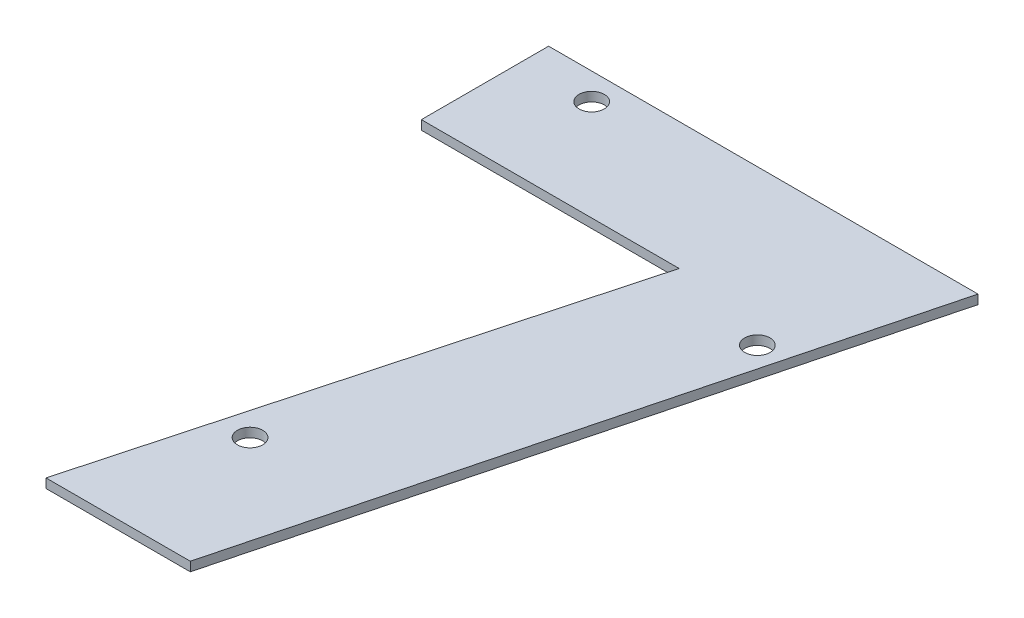
ISO-10303-21;
HEADER;
FILE_DESCRIPTION(('STEP AP214'),'2;1');
FILE_NAME('part.step','',(''),(''),'','','');
FILE_SCHEMA(('AUTOMOTIVE_DESIGN { 1 0 10303 214 1 1 1 1 }'));
ENDSEC;
DATA;
#1=APPLICATION_CONTEXT('core data for automotive mechanical design processes');
#2=APPLICATION_PROTOCOL_DEFINITION('international standard','automotive_design',2000,#1);
#3=PRODUCT_CONTEXT('',#1,'mechanical');
#4=PRODUCT('Part','Part','',(#3));
#5=PRODUCT_RELATED_PRODUCT_CATEGORY('part','',(#4));
#6=PRODUCT_DEFINITION_FORMATION('','',#4);
#7=PRODUCT_DEFINITION_CONTEXT('part definition',#1,'design');
#8=PRODUCT_DEFINITION('design','',#6,#7);
#9=PRODUCT_DEFINITION_SHAPE('','',#8);
#10=(LENGTH_UNIT() NAMED_UNIT(*) SI_UNIT(.MILLI.,.METRE.));
#11=(NAMED_UNIT(*) PLANE_ANGLE_UNIT() SI_UNIT($,.RADIAN.));
#12=(NAMED_UNIT(*) SI_UNIT($,.STERADIAN.) SOLID_ANGLE_UNIT());
#13=UNCERTAINTY_MEASURE_WITH_UNIT(LENGTH_MEASURE(1.E-05),#10,'distance_accuracy_value','');
#14=(GEOMETRIC_REPRESENTATION_CONTEXT(3) GLOBAL_UNCERTAINTY_ASSIGNED_CONTEXT((#13)) GLOBAL_UNIT_ASSIGNED_CONTEXT((#10,
#11,#12)) REPRESENTATION_CONTEXT('',''));
#15=CARTESIAN_POINT('',(0.,0.,0.));
#16=DIRECTION('',(0.,0.,1.));
#17=DIRECTION('',(1.,0.,0.));
#18=AXIS2_PLACEMENT_3D('',#15,#16,#17);
#19=CARTESIAN_POINT('',(-32.8064300635889,2.,-24.3237173628121));
#20=DIRECTION('',(1.,0.,0.));
#21=DIRECTION('',(0.,0.,-1.));
#22=AXIS2_PLACEMENT_3D('',#19,#20,#21);
#23=PLANE('',#22);
#24=DIRECTION('',(0.,0.,1.));
#25=VECTOR('',#24,1.);
#26=CARTESIAN_POINT('',(-32.8064300635889,0.,-24.3237173628121));
#27=LINE('',#26,#25);
#28=CARTESIAN_POINT('',(-32.8064300635889,0.,-51.9945518958334));
#29=VERTEX_POINT('',#28);
#30=CARTESIAN_POINT('',(-32.8064300635889,0.,-24.3237173628121));
#31=VERTEX_POINT('',#30);
#32=EDGE_CURVE('E124',#29,#31,#27,.T.);
#33=ORIENTED_EDGE('',*,*,#32,.T.);
#34=DIRECTION('',(0.,-1.,0.));
#35=VECTOR('',#34,1.);
#36=CARTESIAN_POINT('',(-32.8064300635889,2.,-24.3237173628121));
#37=LINE('',#36,#35);
#38=CARTESIAN_POINT('',(-32.8064300635889,2.,-24.3237173628121));
#39=VERTEX_POINT('',#38);
#40=EDGE_CURVE('E11',#39,#31,#37,.T.);
#41=ORIENTED_EDGE('',*,*,#40,.F.);
#42=DIRECTION('',(0.,0.,1.));
#43=VECTOR('',#42,1.);
#44=CARTESIAN_POINT('',(-32.8064300635889,2.,-24.3237173628121));
#45=LINE('',#44,#43);
#46=CARTESIAN_POINT('',(-32.8064300635889,2.,-51.9945518958334));
#47=VERTEX_POINT('',#46);
#48=EDGE_CURVE('E133',#47,#39,#45,.T.);
#49=ORIENTED_EDGE('',*,*,#48,.F.);
#50=DIRECTION('',(0.,-1.,0.));
#51=VECTOR('',#50,1.);
#52=CARTESIAN_POINT('',(-32.8064300635889,2.,-51.9945518958334));
#53=LINE('',#52,#51);
#54=EDGE_CURVE('E118',#47,#29,#53,.T.);
#55=ORIENTED_EDGE('',*,*,#54,.T.);
#56=EDGE_LOOP('',(#33,#41,#49,#55));
#57=FACE_BOUND('',#56,.T.);
#58=ADVANCED_FACE('F39',(#57),#23,.F.);
#59=CARTESIAN_POINT('',(23.2499762576878,2.,-24.3237173628121));
#60=DIRECTION('',(0.,0.,-1.));
#61=DIRECTION('',(-1.,0.,0.));
#62=AXIS2_PLACEMENT_3D('',#59,#60,#61);
#63=PLANE('',#62);
#64=DIRECTION('',(1.,0.,0.));
#65=VECTOR('',#64,1.);
#66=CARTESIAN_POINT('',(23.2499762576878,0.,-24.3237173628121));
#67=LINE('',#66,#65);
#68=CARTESIAN_POINT('',(23.2499762576878,0.,-24.3237173628121));
#69=VERTEX_POINT('',#68);
#70=EDGE_CURVE('E128',#31,#69,#67,.T.);
#71=ORIENTED_EDGE('',*,*,#70,.T.);
#72=DIRECTION('',(0.,-1.,0.));
#73=VECTOR('',#72,1.);
#74=CARTESIAN_POINT('',(23.2499762576878,2.,-24.3237173628121));
#75=LINE('',#74,#73);
#76=CARTESIAN_POINT('',(23.2499762576878,2.,-24.3237173628121));
#77=VERTEX_POINT('',#76);
#78=EDGE_CURVE('E50',#77,#69,#75,.T.);
#79=ORIENTED_EDGE('',*,*,#78,.F.);
#80=DIRECTION('',(1.,0.,0.));
#81=VECTOR('',#80,1.);
#82=CARTESIAN_POINT('',(23.2499762576878,2.,-24.3237173628121));
#83=LINE('',#82,#81);
#84=EDGE_CURVE('E94',#39,#77,#83,.T.);
#85=ORIENTED_EDGE('',*,*,#84,.F.);
#86=ORIENTED_EDGE('',*,*,#40,.T.);
#87=EDGE_LOOP('',(#71,#79,#85,#86));
#88=FACE_BOUND('',#87,.T.);
#89=ADVANCED_FACE('F156',(#88),#63,.F.);
#90=CARTESIAN_POINT('',(-6.1499322272503,2.,83.9464423950171));
#91=DIRECTION('',(0.96505356737013,0.,0.26205268956106));
#92=DIRECTION('',(0.26205268956106,0.,-0.96505356737013));
#93=AXIS2_PLACEMENT_3D('',#90,#91,#92);
#94=PLANE('',#93);
#95=DIRECTION('',(-0.26205268956106,0.,0.96505356737013));
#96=VECTOR('',#95,1.);
#97=CARTESIAN_POINT('',(-6.1499322272503,0.,83.9464423950171));
#98=LINE('',#97,#96);
#99=CARTESIAN_POINT('',(-6.1499322272503,0.,83.9464423950171));
#100=VERTEX_POINT('',#99);
#101=EDGE_CURVE('E129',#69,#100,#98,.T.);
#102=ORIENTED_EDGE('',*,*,#101,.T.);
#103=DIRECTION('',(0.,-1.,0.));
#104=VECTOR('',#103,1.);
#105=CARTESIAN_POINT('',(-6.1499322272503,2.,83.9464423950171));
#106=LINE('',#105,#104);
#107=CARTESIAN_POINT('',(-6.1499322272503,2.,83.9464423950171));
#108=VERTEX_POINT('',#107);
#109=EDGE_CURVE('E112',#108,#100,#106,.T.);
#110=ORIENTED_EDGE('',*,*,#109,.F.);
#111=DIRECTION('',(-0.26205268956106,0.,0.96505356737013));
#112=VECTOR('',#111,1.);
#113=CARTESIAN_POINT('',(-6.1499322272503,2.,83.9464423950171));
#114=LINE('',#113,#112);
#115=EDGE_CURVE('E102',#77,#108,#114,.T.);
#116=ORIENTED_EDGE('',*,*,#115,.F.);
#117=ORIENTED_EDGE('',*,*,#78,.T.);
#118=EDGE_LOOP('',(#102,#110,#116,#117));
#119=FACE_BOUND('',#118,.T.);
#120=ADVANCED_FACE('F138',(#119),#94,.F.);
#121=CARTESIAN_POINT('',(25.2250392660188,2.,83.9464423950171));
#122=DIRECTION('',(0.,0.,-1.));
#123=DIRECTION('',(-1.,0.,0.));
#124=AXIS2_PLACEMENT_3D('',#121,#122,#123);
#125=PLANE('',#124);
#126=DIRECTION('',(1.,0.,0.));
#127=VECTOR('',#126,1.);
#128=CARTESIAN_POINT('',(25.2250392660188,0.,83.9464423950171));
#129=LINE('',#128,#127);
#130=CARTESIAN_POINT('',(25.2250392660188,0.,83.9464423950171));
#131=VERTEX_POINT('',#130);
#132=EDGE_CURVE('E113',#100,#131,#129,.T.);
#133=ORIENTED_EDGE('',*,*,#132,.T.);
#134=DIRECTION('',(0.,-1.,0.));
#135=VECTOR('',#134,1.);
#136=CARTESIAN_POINT('',(25.2250392660188,2.,83.9464423950171));
#137=LINE('',#136,#135);
#138=CARTESIAN_POINT('',(25.2250392660188,2.,83.9464423950171));
#139=VERTEX_POINT('',#138);
#140=EDGE_CURVE('E109',#139,#131,#137,.T.);
#141=ORIENTED_EDGE('',*,*,#140,.F.);
#142=DIRECTION('',(1.,0.,0.));
#143=VECTOR('',#142,1.);
#144=CARTESIAN_POINT('',(25.2250392660188,2.,83.9464423950171));
#145=LINE('',#144,#143);
#146=EDGE_CURVE('E100',#108,#139,#145,.T.);
#147=ORIENTED_EDGE('',*,*,#146,.F.);
#148=ORIENTED_EDGE('',*,*,#109,.T.);
#149=EDGE_LOOP('',(#133,#141,#147,#148));
#150=FACE_BOUND('',#149,.T.);
#151=ADVANCED_FACE('F111',(#150),#125,.F.);
#152=CARTESIAN_POINT('',(60.5527404850548,2.,-51.9945518958334));
#153=DIRECTION('',(-0.967851902384067,0.,-0.251520764652825));
#154=DIRECTION('',(-0.251520764652825,0.,0.967851902384067));
#155=AXIS2_PLACEMENT_3D('',#152,#153,#154);
#156=PLANE('',#155);
#157=DIRECTION('',(0.251520764652825,0.,-0.967851902384067));
#158=VECTOR('',#157,1.);
#159=CARTESIAN_POINT('',(60.5527404850548,0.,-51.9945518958334));
#160=LINE('',#159,#158);
#161=CARTESIAN_POINT('',(60.5527404850548,0.,-51.9945518958334));
#162=VERTEX_POINT('',#161);
#163=EDGE_CURVE('E76',#131,#162,#160,.T.);
#164=ORIENTED_EDGE('',*,*,#163,.T.);
#165=DIRECTION('',(0.,-1.,0.));
#166=VECTOR('',#165,1.);
#167=CARTESIAN_POINT('',(60.5527404850548,2.,-51.9945518958334));
#168=LINE('',#167,#166);
#169=CARTESIAN_POINT('',(60.5527404850548,2.,-51.9945518958334));
#170=VERTEX_POINT('',#169);
#171=EDGE_CURVE('E114',#170,#162,#168,.T.);
#172=ORIENTED_EDGE('',*,*,#171,.F.);
#173=DIRECTION('',(0.251520764652825,0.,-0.967851902384067));
#174=VECTOR('',#173,1.);
#175=CARTESIAN_POINT('',(60.5527404850548,2.,-51.9945518958334));
#176=LINE('',#175,#174);
#177=EDGE_CURVE('E101',#139,#170,#176,.T.);
#178=ORIENTED_EDGE('',*,*,#177,.F.);
#179=ORIENTED_EDGE('',*,*,#140,.T.);
#180=EDGE_LOOP('',(#164,#172,#178,#179));
#181=FACE_BOUND('',#180,.T.);
#182=ADVANCED_FACE('F120',(#181),#156,.F.);
#183=CARTESIAN_POINT('',(-32.8064300635889,2.,-51.9945518958334));
#184=DIRECTION('',(0.,0.,1.));
#185=DIRECTION('',(1.,0.,0.));
#186=AXIS2_PLACEMENT_3D('',#183,#184,#185);
#187=PLANE('',#186);
#188=DIRECTION('',(-1.,0.,0.));
#189=VECTOR('',#188,1.);
#190=CARTESIAN_POINT('',(-32.8064300635889,0.,-51.9945518958334));
#191=LINE('',#190,#189);
#192=EDGE_CURVE('E84',#162,#29,#191,.T.);
#193=ORIENTED_EDGE('',*,*,#192,.T.);
#194=ORIENTED_EDGE('',*,*,#54,.F.);
#195=DIRECTION('',(-1.,0.,0.));
#196=VECTOR('',#195,1.);
#197=CARTESIAN_POINT('',(-32.8064300635889,2.,-51.9945518958334));
#198=LINE('',#197,#196);
#199=EDGE_CURVE('E54',#170,#47,#198,.T.);
#200=ORIENTED_EDGE('',*,*,#199,.F.);
#201=ORIENTED_EDGE('',*,*,#171,.T.);
#202=EDGE_LOOP('',(#193,#194,#200,#201));
#203=FACE_BOUND('',#202,.T.);
#204=ADVANCED_FACE('F150',(#203),#187,.F.);
#205=CARTESIAN_POINT('',(0.,2.,0.));
#206=DIRECTION('',(0.,-1.,0.));
#207=DIRECTION('',(0.,0.,-1.));
#208=AXIS2_PLACEMENT_3D('',#205,#206,#207);
#209=PLANE('',#208);
#210=CARTESIAN_POINT('',(-17.6753518502399,2.,-46.2307594645404));
#211=DIRECTION('',(0.,1.,0.));
#212=DIRECTION('',(0.,0.,1.));
#213=AXIS2_PLACEMENT_3D('',#210,#211,#212);
#214=CIRCLE('',#213,2.75000000000001);
#215=CARTESIAN_POINT('',(-17.6753518502399,2.,-43.4807594645404));
#216=VERTEX_POINT('',#215);
#217=EDGE_CURVE('E130',#216,#216,#214,.T.);
#218=ORIENTED_EDGE('',*,*,#217,.F.);
#219=EDGE_LOOP('',(#218));
#220=FACE_BOUND('',#219,.T.);
#221=CARTESIAN_POINT('',(46.1882530103708,2.,-18.3851110471664));
#222=DIRECTION('',(0.,1.,0.));
#223=DIRECTION('',(0.,0.,1.));
#224=AXIS2_PLACEMENT_3D('',#221,#222,#223);
#225=CIRCLE('',#224,2.75000000000001);
#226=CARTESIAN_POINT('',(46.1882530103708,2.,-15.6351110471664));
#227=VERTEX_POINT('',#226);
#228=EDGE_CURVE('E239',#227,#227,#225,.T.);
#229=ORIENTED_EDGE('',*,*,#228,.F.);
#230=EDGE_LOOP('',(#229));
#231=FACE_BOUND('',#230,.T.);
#232=CARTESIAN_POINT('',(8.43115989209764,2.,54.160966993777));
#233=DIRECTION('',(0.,1.,0.));
#234=DIRECTION('',(0.,0.,1.));
#235=AXIS2_PLACEMENT_3D('',#232,#233,#234);
#236=CIRCLE('',#235,2.75000000000001);
#237=CARTESIAN_POINT('',(8.43115989209764,2.,56.910966993777));
#238=VERTEX_POINT('',#237);
#239=EDGE_CURVE('E247',#238,#238,#236,.T.);
#240=ORIENTED_EDGE('',*,*,#239,.F.);
#241=EDGE_LOOP('',(#240));
#242=FACE_BOUND('',#241,.T.);
#243=ORIENTED_EDGE('',*,*,#48,.T.);
#244=ORIENTED_EDGE('',*,*,#84,.T.);
#245=ORIENTED_EDGE('',*,*,#115,.T.);
#246=ORIENTED_EDGE('',*,*,#146,.T.);
#247=ORIENTED_EDGE('',*,*,#177,.T.);
#248=ORIENTED_EDGE('',*,*,#199,.T.);
#249=EDGE_LOOP('',(#243,#244,#245,#246,#247,#248));
#250=FACE_BOUND('',#249,.T.);
#251=ADVANCED_FACE('F103',(#220,#231,#242,#250),#209,.F.);
#252=CARTESIAN_POINT('',(0.,0.,0.));
#253=DIRECTION('',(0.,-1.,0.));
#254=DIRECTION('',(0.,0.,-1.));
#255=AXIS2_PLACEMENT_3D('',#252,#253,#254);
#256=PLANE('',#255);
#257=CARTESIAN_POINT('',(-17.6753518502399,0.,-46.2307594645404));
#258=DIRECTION('',(0.,1.,0.));
#259=DIRECTION('',(0.,0.,1.));
#260=AXIS2_PLACEMENT_3D('',#257,#258,#259);
#261=CIRCLE('',#260,2.75000000000001);
#262=CARTESIAN_POINT('',(-17.6753518502399,0.,-43.4807594645404));
#263=VERTEX_POINT('',#262);
#264=EDGE_CURVE('E232',#263,#263,#261,.T.);
#265=ORIENTED_EDGE('',*,*,#264,.T.);
#266=EDGE_LOOP('',(#265));
#267=FACE_BOUND('',#266,.T.);
#268=CARTESIAN_POINT('',(46.1882530103708,0.,-18.3851110471664));
#269=DIRECTION('',(0.,1.,0.));
#270=DIRECTION('',(0.,0.,1.));
#271=AXIS2_PLACEMENT_3D('',#268,#269,#270);
#272=CIRCLE('',#271,2.75000000000001);
#273=CARTESIAN_POINT('',(46.1882530103708,0.,-15.6351110471664));
#274=VERTEX_POINT('',#273);
#275=EDGE_CURVE('E236',#274,#274,#272,.T.);
#276=ORIENTED_EDGE('',*,*,#275,.T.);
#277=EDGE_LOOP('',(#276));
#278=FACE_BOUND('',#277,.T.);
#279=CARTESIAN_POINT('',(8.43115989209764,0.,54.160966993777));
#280=DIRECTION('',(0.,1.,0.));
#281=DIRECTION('',(0.,0.,1.));
#282=AXIS2_PLACEMENT_3D('',#279,#280,#281);
#283=CIRCLE('',#282,2.75000000000001);
#284=CARTESIAN_POINT('',(8.43115989209764,0.,56.910966993777));
#285=VERTEX_POINT('',#284);
#286=EDGE_CURVE('E244',#285,#285,#283,.T.);
#287=ORIENTED_EDGE('',*,*,#286,.T.);
#288=EDGE_LOOP('',(#287));
#289=FACE_BOUND('',#288,.T.);
#290=ORIENTED_EDGE('',*,*,#32,.F.);
#291=ORIENTED_EDGE('',*,*,#192,.F.);
#292=ORIENTED_EDGE('',*,*,#163,.F.);
#293=ORIENTED_EDGE('',*,*,#132,.F.);
#294=ORIENTED_EDGE('',*,*,#101,.F.);
#295=ORIENTED_EDGE('',*,*,#70,.F.);
#296=EDGE_LOOP('',(#290,#291,#292,#293,#294,#295));
#297=FACE_BOUND('',#296,.T.);
#298=ADVANCED_FACE('F141',(#267,#278,#289,#297),#256,.T.);
#299=CARTESIAN_POINT('',(8.43115989209764,2.,54.160966993777));
#300=DIRECTION('',(0.,-1.,0.));
#301=DIRECTION('',(0.,0.,-1.));
#302=AXIS2_PLACEMENT_3D('',#299,#300,#301);
#303=CYLINDRICAL_SURFACE('',#302,2.75000000000001);
#304=ORIENTED_EDGE('',*,*,#239,.T.);
#305=EDGE_LOOP('',(#304));
#306=FACE_BOUND('',#305,.T.);
#307=ORIENTED_EDGE('',*,*,#286,.F.);
#308=EDGE_LOOP('',(#307));
#309=FACE_BOUND('',#308,.T.);
#310=ADVANCED_FACE('F199',(#306,#309),#303,.F.);
#311=CARTESIAN_POINT('',(46.1882530103708,2.,-18.3851110471664));
#312=DIRECTION('',(0.,-1.,0.));
#313=DIRECTION('',(0.,0.,-1.));
#314=AXIS2_PLACEMENT_3D('',#311,#312,#313);
#315=CYLINDRICAL_SURFACE('',#314,2.75000000000001);
#316=ORIENTED_EDGE('',*,*,#228,.T.);
#317=EDGE_LOOP('',(#316));
#318=FACE_BOUND('',#317,.T.);
#319=ORIENTED_EDGE('',*,*,#275,.F.);
#320=EDGE_LOOP('',(#319));
#321=FACE_BOUND('',#320,.T.);
#322=ADVANCED_FACE('F210',(#318,#321),#315,.F.);
#323=CARTESIAN_POINT('',(-17.6753518502399,2.,-46.2307594645404));
#324=DIRECTION('',(0.,-1.,0.));
#325=DIRECTION('',(0.,0.,-1.));
#326=AXIS2_PLACEMENT_3D('',#323,#324,#325);
#327=CYLINDRICAL_SURFACE('',#326,2.75000000000001);
#328=ORIENTED_EDGE('',*,*,#217,.T.);
#329=EDGE_LOOP('',(#328));
#330=FACE_BOUND('',#329,.T.);
#331=ORIENTED_EDGE('',*,*,#264,.F.);
#332=EDGE_LOOP('',(#331));
#333=FACE_BOUND('',#332,.T.);
#334=ADVANCED_FACE('F217',(#330,#333),#327,.F.);
#335=CLOSED_SHELL('',(#58,#89,#120,#151,#182,#204,#251,#298,#310,#322,#334));
#336=MANIFOLD_SOLID_BREP('B2',#335);
#337=ADVANCED_BREP_SHAPE_REPRESENTATION('',(#18,#336),#14);
#338=SHAPE_DEFINITION_REPRESENTATION(#9,#337);
ENDSEC;
END-ISO-10303-21;
